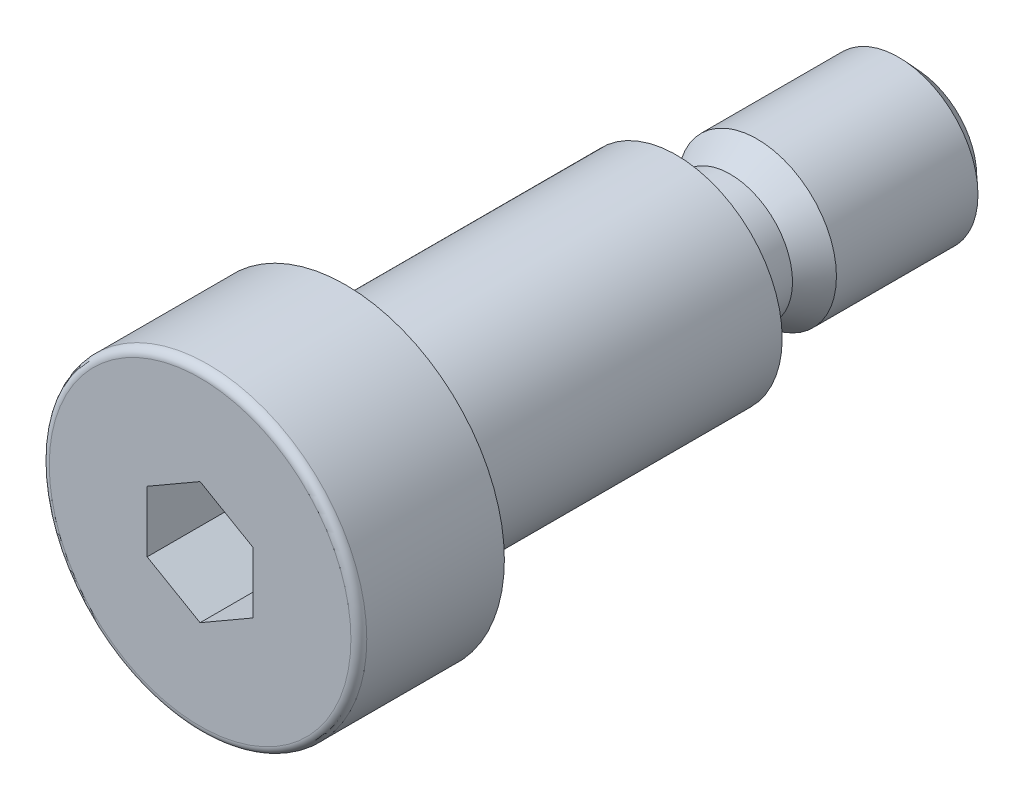
ISO-10303-21;
HEADER;
FILE_DESCRIPTION(('STEP AP214'),'2;1');
FILE_NAME('part.step','',(''),(''),'','','');
FILE_SCHEMA(('AUTOMOTIVE_DESIGN { 1 0 10303 214 1 1 1 1 }'));
ENDSEC;
DATA;
#1=APPLICATION_CONTEXT('core data for automotive mechanical design processes');
#2=APPLICATION_PROTOCOL_DEFINITION('international standard','automotive_design',2000,#1);
#3=PRODUCT_CONTEXT('',#1,'mechanical');
#4=PRODUCT('Part','Part','',(#3));
#5=PRODUCT_RELATED_PRODUCT_CATEGORY('part','',(#4));
#6=PRODUCT_DEFINITION_FORMATION('','',#4);
#7=PRODUCT_DEFINITION_CONTEXT('part definition',#1,'design');
#8=PRODUCT_DEFINITION('design','',#6,#7);
#9=PRODUCT_DEFINITION_SHAPE('','',#8);
#10=(LENGTH_UNIT() NAMED_UNIT(*) SI_UNIT(.MILLI.,.METRE.));
#11=(NAMED_UNIT(*) PLANE_ANGLE_UNIT() SI_UNIT($,.RADIAN.));
#12=(NAMED_UNIT(*) SI_UNIT($,.STERADIAN.) SOLID_ANGLE_UNIT());
#13=UNCERTAINTY_MEASURE_WITH_UNIT(LENGTH_MEASURE(1.E-05),#10,'distance_accuracy_value','');
#14=(GEOMETRIC_REPRESENTATION_CONTEXT(3) GLOBAL_UNCERTAINTY_ASSIGNED_CONTEXT((#13)) GLOBAL_UNIT_ASSIGNED_CONTEXT((#10,
#11,#12)) REPRESENTATION_CONTEXT('',''));
#15=CARTESIAN_POINT('',(0.,0.,0.));
#16=DIRECTION('',(0.,0.,1.));
#17=DIRECTION('',(1.,0.,0.));
#18=AXIS2_PLACEMENT_3D('',#15,#16,#17);
#19=CARTESIAN_POINT('',(0.,0.,23.5));
#20=DIRECTION('',(0.,0.,1.));
#21=DIRECTION('',(1.,0.,0.));
#22=AXIS2_PLACEMENT_3D('',#19,#20,#21);
#23=PLANE('',#22);
#24=CARTESIAN_POINT('',(0.,0.,23.5));
#25=DIRECTION('',(0.,0.,1.));
#26=DIRECTION('',(1.,0.,0.));
#27=AXIS2_PLACEMENT_3D('',#24,#25,#26);
#28=CIRCLE('',#27,11.4);
#29=CARTESIAN_POINT('',(11.4,0.,23.5));
#30=VERTEX_POINT('',#29);
#31=EDGE_CURVE('E42',#30,#30,#28,.T.);
#32=ORIENTED_EDGE('',*,*,#31,.T.);
#33=EDGE_LOOP('',(#32));
#34=FACE_BOUND('',#33,.T.);
#35=DIRECTION('',(0.,1.,0.));
#36=VECTOR('',#35,1.);
#37=CARTESIAN_POINT('',(4.,-2.30940107675851,23.5));
#38=LINE('',#37,#36);
#39=CARTESIAN_POINT('',(4.,-2.30940107675851,23.5));
#40=VERTEX_POINT('',#39);
#41=CARTESIAN_POINT('',(4.,2.3094010767585,23.5));
#42=VERTEX_POINT('',#41);
#43=EDGE_CURVE('E49',#40,#42,#38,.T.);
#44=ORIENTED_EDGE('',*,*,#43,.F.);
#45=DIRECTION('',(0.866025403784439,0.5,0.));
#46=VECTOR('',#45,1.);
#47=CARTESIAN_POINT('',(0.,-4.61880215351701,23.5));
#48=LINE('',#47,#46);
#49=CARTESIAN_POINT('',(0.,-4.61880215351701,23.5));
#50=VERTEX_POINT('',#49);
#51=EDGE_CURVE('E132',#50,#40,#48,.T.);
#52=ORIENTED_EDGE('',*,*,#51,.F.);
#53=DIRECTION('',(0.866025403784439,-0.5,0.));
#54=VECTOR('',#53,1.);
#55=CARTESIAN_POINT('',(-4.,-2.3094010767585,23.5));
#56=LINE('',#55,#54);
#57=CARTESIAN_POINT('',(-4.,-2.3094010767585,23.5));
#58=VERTEX_POINT('',#57);
#59=EDGE_CURVE('E130',#58,#50,#56,.T.);
#60=ORIENTED_EDGE('',*,*,#59,.F.);
#61=DIRECTION('',(0.,-1.,0.));
#62=VECTOR('',#61,1.);
#63=CARTESIAN_POINT('',(-4.,2.30940107675851,23.5));
#64=LINE('',#63,#62);
#65=CARTESIAN_POINT('',(-4.,2.30940107675851,23.5));
#66=VERTEX_POINT('',#65);
#67=EDGE_CURVE('E97',#66,#58,#64,.T.);
#68=ORIENTED_EDGE('',*,*,#67,.F.);
#69=DIRECTION('',(-0.866025403784439,-0.5,0.));
#70=VECTOR('',#69,1.);
#71=CARTESIAN_POINT('',(0.,4.61880215351701,23.5));
#72=LINE('',#71,#70);
#73=CARTESIAN_POINT('',(0.,4.61880215351701,23.5));
#74=VERTEX_POINT('',#73);
#75=EDGE_CURVE('E126',#74,#66,#72,.T.);
#76=ORIENTED_EDGE('',*,*,#75,.F.);
#77=DIRECTION('',(-0.866025403784439,0.5,0.));
#78=VECTOR('',#77,1.);
#79=CARTESIAN_POINT('',(4.,2.3094010767585,23.5));
#80=LINE('',#79,#78);
#81=EDGE_CURVE('E123',#42,#74,#80,.T.);
#82=ORIENTED_EDGE('',*,*,#81,.F.);
#83=EDGE_LOOP('',(#44,#52,#60,#68,#76,#82));
#84=FACE_BOUND('',#83,.T.);
#85=ADVANCED_FACE('F34',(#34,#84),#23,.T.);
#86=CARTESIAN_POINT('',(0.,0.,-30.5));
#87=DIRECTION('',(0.,0.,1.));
#88=DIRECTION('',(1.,0.,0.));
#89=AXIS2_PLACEMENT_3D('',#86,#87,#88);
#90=PLANE('',#89);
#91=CARTESIAN_POINT('',(0.,0.,-30.5));
#92=DIRECTION('',(0.,0.,1.));
#93=DIRECTION('',(1.,0.,0.));
#94=AXIS2_PLACEMENT_3D('',#91,#92,#93);
#95=CIRCLE('',#94,4.7);
#96=CARTESIAN_POINT('',(4.7,0.,-30.5));
#97=VERTEX_POINT('',#96);
#98=EDGE_CURVE('E162',#97,#97,#95,.T.);
#99=ORIENTED_EDGE('',*,*,#98,.F.);
#100=EDGE_LOOP('',(#99));
#101=FACE_BOUND('',#100,.T.);
#102=ADVANCED_FACE('F178',(#101),#90,.F.);
#103=CARTESIAN_POINT('',(0.,0.,-30.5));
#104=DIRECTION('',(0.,0.,1.));
#105=DIRECTION('',(1.,0.,0.));
#106=AXIS2_PLACEMENT_3D('',#103,#104,#105);
#107=CONICAL_SURFACE('',#106,4.7,0.825376850520741);
#108=CARTESIAN_POINT('',(0.,0.,-29.3));
#109=DIRECTION('',(0.,0.,1.));
#110=DIRECTION('',(1.,0.,0.));
#111=AXIS2_PLACEMENT_3D('',#108,#109,#110);
#112=CIRCLE('',#111,6.);
#113=CARTESIAN_POINT('',(6.,0.,-29.3));
#114=VERTEX_POINT('',#113);
#115=EDGE_CURVE('E159',#114,#114,#112,.T.);
#116=ORIENTED_EDGE('',*,*,#115,.F.);
#117=EDGE_LOOP('',(#116));
#118=FACE_BOUND('',#117,.T.);
#119=ORIENTED_EDGE('',*,*,#98,.T.);
#120=EDGE_LOOP('',(#119));
#121=FACE_BOUND('',#120,.T.);
#122=ADVANCED_FACE('F182',(#118,#121),#107,.T.);
#123=CARTESIAN_POINT('',(0.,0.,23.5));
#124=DIRECTION('',(0.,0.,1.));
#125=DIRECTION('',(1.,0.,0.));
#126=AXIS2_PLACEMENT_3D('',#123,#124,#125);
#127=CYLINDRICAL_SURFACE('',#126,6.);
#128=CARTESIAN_POINT('',(0.,0.,-18.6));
#129=DIRECTION('',(0.,0.,1.));
#130=DIRECTION('',(1.,0.,0.));
#131=AXIS2_PLACEMENT_3D('',#128,#129,#130);
#132=CIRCLE('',#131,6.);
#133=CARTESIAN_POINT('',(6.,0.,-18.6));
#134=VERTEX_POINT('',#133);
#135=EDGE_CURVE('E156',#134,#134,#132,.T.);
#136=ORIENTED_EDGE('',*,*,#135,.F.);
#137=EDGE_LOOP('',(#136));
#138=FACE_BOUND('',#137,.T.);
#139=ORIENTED_EDGE('',*,*,#115,.T.);
#140=EDGE_LOOP('',(#139));
#141=FACE_BOUND('',#140,.T.);
#142=ADVANCED_FACE('F188',(#138,#141),#127,.T.);
#143=CARTESIAN_POINT('',(0.,0.,-18.6));
#144=DIRECTION('',(0.,0.,-1.));
#145=DIRECTION('',(-1.,0.,0.));
#146=AXIS2_PLACEMENT_3D('',#143,#144,#145);
#147=CONICAL_SURFACE('',#146,6.,0.571837729916959);
#148=CARTESIAN_POINT('',(0.,0.,-16.58));
#149=DIRECTION('',(0.,0.,1.));
#150=DIRECTION('',(1.,0.,0.));
#151=AXIS2_PLACEMENT_3D('',#148,#149,#150);
#152=CIRCLE('',#151,4.7);
#153=CARTESIAN_POINT('',(4.7,0.,-16.58));
#154=VERTEX_POINT('',#153);
#155=EDGE_CURVE('E153',#154,#154,#152,.T.);
#156=ORIENTED_EDGE('',*,*,#155,.F.);
#157=EDGE_LOOP('',(#156));
#158=FACE_BOUND('',#157,.T.);
#159=ORIENTED_EDGE('',*,*,#135,.T.);
#160=EDGE_LOOP('',(#159));
#161=FACE_BOUND('',#160,.T.);
#162=ADVANCED_FACE('F192',(#158,#161),#147,.T.);
#163=CARTESIAN_POINT('',(0.,0.,23.5));
#164=DIRECTION('',(0.,0.,1.));
#165=DIRECTION('',(1.,0.,0.));
#166=AXIS2_PLACEMENT_3D('',#163,#164,#165);
#167=CYLINDRICAL_SURFACE('',#166,4.7);
#168=ORIENTED_EDGE('',*,*,#155,.T.);
#169=EDGE_LOOP('',(#168));
#170=FACE_BOUND('',#169,.T.);
#171=CARTESIAN_POINT('',(0.,0.,-12.5));
#172=DIRECTION('',(0.,0.,1.));
#173=DIRECTION('',(1.,0.,0.));
#174=AXIS2_PLACEMENT_3D('',#171,#172,#173);
#175=CIRCLE('',#174,4.7);
#176=CARTESIAN_POINT('',(4.7,0.,-12.5));
#177=VERTEX_POINT('',#176);
#178=EDGE_CURVE('E150',#177,#177,#175,.T.);
#179=ORIENTED_EDGE('',*,*,#178,.F.);
#180=EDGE_LOOP('',(#179));
#181=FACE_BOUND('',#180,.T.);
#182=ADVANCED_FACE('F196',(#170,#181),#167,.T.);
#183=CARTESIAN_POINT('',(0.,0.,-12.5));
#184=DIRECTION('',(0.,0.,1.));
#185=DIRECTION('',(1.,0.,0.));
#186=AXIS2_PLACEMENT_3D('',#183,#184,#185);
#187=PLANE('',#186);
#188=CARTESIAN_POINT('',(0.,0.,-12.5));
#189=DIRECTION('',(0.,0.,1.));
#190=DIRECTION('',(1.,0.,0.));
#191=AXIS2_PLACEMENT_3D('',#188,#189,#190);
#192=CIRCLE('',#191,7.99999999999999);
#193=CARTESIAN_POINT('',(7.99999999999999,0.,-12.5));
#194=VERTEX_POINT('',#193);
#195=EDGE_CURVE('E147',#194,#194,#192,.T.);
#196=ORIENTED_EDGE('',*,*,#195,.F.);
#197=EDGE_LOOP('',(#196));
#198=FACE_BOUND('',#197,.T.);
#199=ORIENTED_EDGE('',*,*,#178,.T.);
#200=EDGE_LOOP('',(#199));
#201=FACE_BOUND('',#200,.T.);
#202=ADVANCED_FACE('F200',(#198,#201),#187,.F.);
#203=CARTESIAN_POINT('',(0.,0.,23.5));
#204=DIRECTION('',(0.,0.,1.));
#205=DIRECTION('',(1.,0.,0.));
#206=AXIS2_PLACEMENT_3D('',#203,#204,#205);
#207=CYLINDRICAL_SURFACE('',#206,7.99999999999999);
#208=ORIENTED_EDGE('',*,*,#195,.T.);
#209=EDGE_LOOP('',(#208));
#210=FACE_BOUND('',#209,.T.);
#211=CARTESIAN_POINT('',(0.,0.,12.5));
#212=DIRECTION('',(0.,0.,1.));
#213=DIRECTION('',(1.,0.,0.));
#214=AXIS2_PLACEMENT_3D('',#211,#212,#213);
#215=CIRCLE('',#214,7.99999999999999);
#216=CARTESIAN_POINT('',(7.99999999999999,0.,12.5));
#217=VERTEX_POINT('',#216);
#218=EDGE_CURVE('E144',#217,#217,#215,.T.);
#219=ORIENTED_EDGE('',*,*,#218,.F.);
#220=EDGE_LOOP('',(#219));
#221=FACE_BOUND('',#220,.T.);
#222=ADVANCED_FACE('F204',(#210,#221),#207,.T.);
#223=CARTESIAN_POINT('',(0.,0.,12.5));
#224=DIRECTION('',(0.,0.,1.));
#225=DIRECTION('',(1.,0.,0.));
#226=AXIS2_PLACEMENT_3D('',#223,#224,#225);
#227=PLANE('',#226);
#228=CARTESIAN_POINT('',(0.,0.,12.5));
#229=DIRECTION('',(0.,0.,1.));
#230=DIRECTION('',(1.,0.,0.));
#231=AXIS2_PLACEMENT_3D('',#228,#229,#230);
#232=CIRCLE('',#231,12.);
#233=CARTESIAN_POINT('',(12.,0.,12.5));
#234=VERTEX_POINT('',#233);
#235=EDGE_CURVE('E136',#234,#234,#232,.T.);
#236=ORIENTED_EDGE('',*,*,#235,.F.);
#237=EDGE_LOOP('',(#236));
#238=FACE_BOUND('',#237,.T.);
#239=ORIENTED_EDGE('',*,*,#218,.T.);
#240=EDGE_LOOP('',(#239));
#241=FACE_BOUND('',#240,.T.);
#242=ADVANCED_FACE('F208',(#238,#241),#227,.F.);
#243=CARTESIAN_POINT('',(0.,0.,23.5));
#244=DIRECTION('',(0.,0.,1.));
#245=DIRECTION('',(1.,0.,0.));
#246=AXIS2_PLACEMENT_3D('',#243,#244,#245);
#247=CYLINDRICAL_SURFACE('',#246,12.);
#248=CARTESIAN_POINT('',(0.,0.,22.9));
#249=DIRECTION('',(0.,0.,1.));
#250=DIRECTION('',(1.,0.,0.));
#251=AXIS2_PLACEMENT_3D('',#248,#249,#250);
#252=CIRCLE('',#251,12.);
#253=CARTESIAN_POINT('',(12.,0.,22.9));
#254=VERTEX_POINT('',#253);
#255=EDGE_CURVE('E11',#254,#254,#252,.F.);
#256=ORIENTED_EDGE('',*,*,#255,.T.);
#257=EDGE_LOOP('',(#256));
#258=FACE_BOUND('',#257,.T.);
#259=ORIENTED_EDGE('',*,*,#235,.T.);
#260=EDGE_LOOP('',(#259));
#261=FACE_BOUND('',#260,.T.);
#262=ADVANCED_FACE('F212',(#258,#261),#247,.T.);
#263=CARTESIAN_POINT('',(4.,-2.30940107675851,16.9));
#264=DIRECTION('',(1.,0.,0.));
#265=DIRECTION('',(0.,0.,-1.));
#266=AXIS2_PLACEMENT_3D('',#263,#264,#265);
#267=PLANE('',#266);
#268=ORIENTED_EDGE('',*,*,#43,.T.);
#269=DIRECTION('',(0.,0.,1.));
#270=VECTOR('',#269,1.);
#271=CARTESIAN_POINT('',(4.,2.3094010767585,16.9));
#272=LINE('',#271,#270);
#273=CARTESIAN_POINT('',(4.,2.3094010767585,16.9));
#274=VERTEX_POINT('',#273);
#275=EDGE_CURVE('E79',#274,#42,#272,.T.);
#276=ORIENTED_EDGE('',*,*,#275,.F.);
#277=DIRECTION('',(0.,1.,0.));
#278=VECTOR('',#277,1.);
#279=CARTESIAN_POINT('',(4.,-2.30940107675851,16.9));
#280=LINE('',#279,#278);
#281=CARTESIAN_POINT('',(4.,-2.30940107675851,16.9));
#282=VERTEX_POINT('',#281);
#283=EDGE_CURVE('E134',#282,#274,#280,.T.);
#284=ORIENTED_EDGE('',*,*,#283,.F.);
#285=DIRECTION('',(0.,0.,1.));
#286=VECTOR('',#285,1.);
#287=CARTESIAN_POINT('',(4.,-2.30940107675851,16.9));
#288=LINE('',#287,#286);
#289=EDGE_CURVE('E57',#282,#40,#288,.T.);
#290=ORIENTED_EDGE('',*,*,#289,.T.);
#291=EDGE_LOOP('',(#268,#276,#284,#290));
#292=FACE_BOUND('',#291,.T.);
#293=ADVANCED_FACE('F216',(#292),#267,.F.);
#294=CARTESIAN_POINT('',(0.,-4.61880215351701,16.9));
#295=DIRECTION('',(0.5,-0.866025403784439,0.));
#296=DIRECTION('',(0.866025403784439,0.5,0.));
#297=AXIS2_PLACEMENT_3D('',#294,#295,#296);
#298=PLANE('',#297);
#299=ORIENTED_EDGE('',*,*,#51,.T.);
#300=ORIENTED_EDGE('',*,*,#289,.F.);
#301=DIRECTION('',(0.866025403784439,0.5,0.));
#302=VECTOR('',#301,1.);
#303=CARTESIAN_POINT('',(0.,-4.61880215351701,16.9));
#304=LINE('',#303,#302);
#305=CARTESIAN_POINT('',(0.,-4.61880215351701,16.9));
#306=VERTEX_POINT('',#305);
#307=EDGE_CURVE('E109',#306,#282,#304,.T.);
#308=ORIENTED_EDGE('',*,*,#307,.F.);
#309=DIRECTION('',(0.,0.,1.));
#310=VECTOR('',#309,1.);
#311=CARTESIAN_POINT('',(0.,-4.61880215351701,16.9));
#312=LINE('',#311,#310);
#313=EDGE_CURVE('E101',#306,#50,#312,.T.);
#314=ORIENTED_EDGE('',*,*,#313,.T.);
#315=EDGE_LOOP('',(#299,#300,#308,#314));
#316=FACE_BOUND('',#315,.T.);
#317=ADVANCED_FACE('F220',(#316),#298,.F.);
#318=CARTESIAN_POINT('',(-4.,-2.3094010767585,16.9));
#319=DIRECTION('',(-0.5,-0.866025403784439,0.));
#320=DIRECTION('',(0.866025403784439,-0.5,0.));
#321=AXIS2_PLACEMENT_3D('',#318,#319,#320);
#322=PLANE('',#321);
#323=ORIENTED_EDGE('',*,*,#59,.T.);
#324=ORIENTED_EDGE('',*,*,#313,.F.);
#325=DIRECTION('',(0.866025403784439,-0.5,0.));
#326=VECTOR('',#325,1.);
#327=CARTESIAN_POINT('',(-4.,-2.3094010767585,16.9));
#328=LINE('',#327,#326);
#329=CARTESIAN_POINT('',(-4.,-2.3094010767585,16.9));
#330=VERTEX_POINT('',#329);
#331=EDGE_CURVE('E105',#330,#306,#328,.T.);
#332=ORIENTED_EDGE('',*,*,#331,.F.);
#333=DIRECTION('',(0.,0.,1.));
#334=VECTOR('',#333,1.);
#335=CARTESIAN_POINT('',(-4.,-2.3094010767585,16.9));
#336=LINE('',#335,#334);
#337=EDGE_CURVE('E90',#330,#58,#336,.T.);
#338=ORIENTED_EDGE('',*,*,#337,.T.);
#339=EDGE_LOOP('',(#323,#324,#332,#338));
#340=FACE_BOUND('',#339,.T.);
#341=ADVANCED_FACE('F106',(#340),#322,.F.);
#342=CARTESIAN_POINT('',(-4.,2.30940107675851,16.9));
#343=DIRECTION('',(-1.,0.,0.));
#344=DIRECTION('',(0.,-1.,0.));
#345=AXIS2_PLACEMENT_3D('',#342,#343,#344);
#346=PLANE('',#345);
#347=ORIENTED_EDGE('',*,*,#67,.T.);
#348=ORIENTED_EDGE('',*,*,#337,.F.);
#349=DIRECTION('',(0.,-1.,0.));
#350=VECTOR('',#349,1.);
#351=CARTESIAN_POINT('',(-4.,2.30940107675851,16.9));
#352=LINE('',#351,#350);
#353=CARTESIAN_POINT('',(-4.,2.30940107675851,16.9));
#354=VERTEX_POINT('',#353);
#355=EDGE_CURVE('E94',#354,#330,#352,.T.);
#356=ORIENTED_EDGE('',*,*,#355,.F.);
#357=DIRECTION('',(0.,0.,1.));
#358=VECTOR('',#357,1.);
#359=CARTESIAN_POINT('',(-4.,2.30940107675851,16.9));
#360=LINE('',#359,#358);
#361=EDGE_CURVE('E102',#354,#66,#360,.T.);
#362=ORIENTED_EDGE('',*,*,#361,.T.);
#363=EDGE_LOOP('',(#347,#348,#356,#362));
#364=FACE_BOUND('',#363,.T.);
#365=ADVANCED_FACE('F92',(#364),#346,.F.);
#366=CARTESIAN_POINT('',(0.,4.61880215351701,16.9));
#367=DIRECTION('',(-0.5,0.866025403784439,0.));
#368=DIRECTION('',(-0.866025403784439,-0.5,0.));
#369=AXIS2_PLACEMENT_3D('',#366,#367,#368);
#370=PLANE('',#369);
#371=ORIENTED_EDGE('',*,*,#75,.T.);
#372=ORIENTED_EDGE('',*,*,#361,.F.);
#373=DIRECTION('',(-0.866025403784439,-0.5,0.));
#374=VECTOR('',#373,1.);
#375=CARTESIAN_POINT('',(0.,4.61880215351701,16.9));
#376=LINE('',#375,#374);
#377=CARTESIAN_POINT('',(0.,4.61880215351701,16.9));
#378=VERTEX_POINT('',#377);
#379=EDGE_CURVE('E115',#378,#354,#376,.T.);
#380=ORIENTED_EDGE('',*,*,#379,.F.);
#381=DIRECTION('',(0.,0.,1.));
#382=VECTOR('',#381,1.);
#383=CARTESIAN_POINT('',(0.,4.61880215351701,16.9));
#384=LINE('',#383,#382);
#385=EDGE_CURVE('E139',#378,#74,#384,.T.);
#386=ORIENTED_EDGE('',*,*,#385,.T.);
#387=EDGE_LOOP('',(#371,#372,#380,#386));
#388=FACE_BOUND('',#387,.T.);
#389=ADVANCED_FACE('F223',(#388),#370,.F.);
#390=CARTESIAN_POINT('',(4.,2.3094010767585,16.9));
#391=DIRECTION('',(0.5,0.866025403784439,0.));
#392=DIRECTION('',(-0.866025403784439,0.5,0.));
#393=AXIS2_PLACEMENT_3D('',#390,#391,#392);
#394=PLANE('',#393);
#395=ORIENTED_EDGE('',*,*,#81,.T.);
#396=ORIENTED_EDGE('',*,*,#385,.F.);
#397=DIRECTION('',(-0.866025403784439,0.5,0.));
#398=VECTOR('',#397,1.);
#399=CARTESIAN_POINT('',(4.,2.3094010767585,16.9));
#400=LINE('',#399,#398);
#401=EDGE_CURVE('E117',#274,#378,#400,.T.);
#402=ORIENTED_EDGE('',*,*,#401,.F.);
#403=ORIENTED_EDGE('',*,*,#275,.T.);
#404=EDGE_LOOP('',(#395,#396,#402,#403));
#405=FACE_BOUND('',#404,.T.);
#406=ADVANCED_FACE('F174',(#405),#394,.F.);
#407=CARTESIAN_POINT('',(0.,0.,16.9));
#408=DIRECTION('',(0.,0.,1.));
#409=DIRECTION('',(1.,0.,0.));
#410=AXIS2_PLACEMENT_3D('',#407,#408,#409);
#411=PLANE('',#410);
#412=ORIENTED_EDGE('',*,*,#283,.T.);
#413=ORIENTED_EDGE('',*,*,#401,.T.);
#414=ORIENTED_EDGE('',*,*,#379,.T.);
#415=ORIENTED_EDGE('',*,*,#355,.T.);
#416=ORIENTED_EDGE('',*,*,#331,.T.);
#417=ORIENTED_EDGE('',*,*,#307,.T.);
#418=EDGE_LOOP('',(#412,#413,#414,#415,#416,#417));
#419=FACE_BOUND('',#418,.T.);
#420=ADVANCED_FACE('F112',(#419),#411,.T.);
#421=CARTESIAN_POINT('',(0.,0.,22.9));
#422=DIRECTION('',(0.,0.,1.));
#423=DIRECTION('',(1.,0.,0.));
#424=AXIS2_PLACEMENT_3D('',#421,#422,#423);
#425=TOROIDAL_SURFACE('',#424,11.4,0.6);
#426=ORIENTED_EDGE('',*,*,#255,.F.);
#427=EDGE_LOOP('',(#426));
#428=FACE_BOUND('',#427,.T.);
#429=ORIENTED_EDGE('',*,*,#31,.F.);
#430=EDGE_LOOP('',(#429));
#431=FACE_BOUND('',#430,.T.);
#432=ADVANCED_FACE('F36',(#428,#431),#425,.T.);
#433=CLOSED_SHELL('',(#85,#102,#122,#142,#162,#182,#202,#222,#242,#262,#293,#317,#341,#365,#389,
#406,#420,#432));
#434=MANIFOLD_SOLID_BREP('B2',#433);
#435=ADVANCED_BREP_SHAPE_REPRESENTATION('',(#18,#434),#14);
#436=SHAPE_DEFINITION_REPRESENTATION(#9,#435);
ENDSEC;
END-ISO-10303-21;
